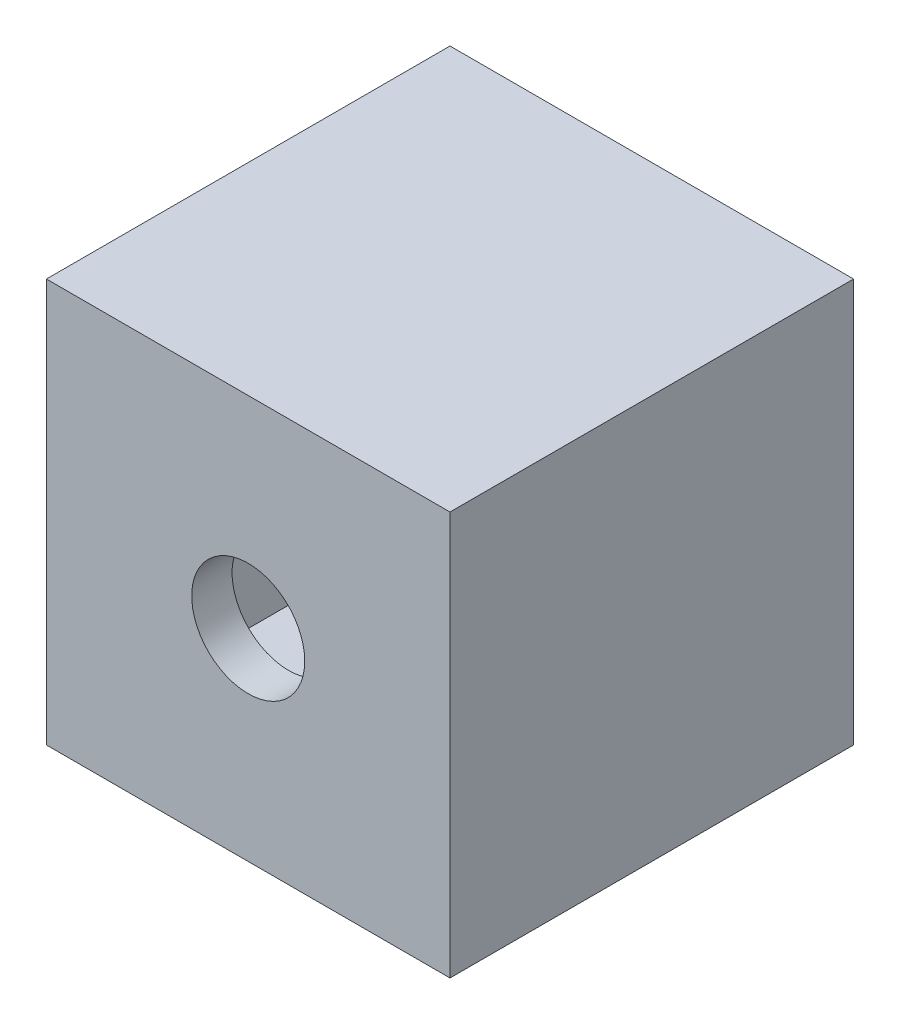
ISO-10303-21;
HEADER;
FILE_DESCRIPTION(('STEP AP214'),'2;1');
FILE_NAME('part.step','',(''),(''),'','','');
FILE_SCHEMA(('AUTOMOTIVE_DESIGN { 1 0 10303 214 1 1 1 1 }'));
ENDSEC;
DATA;
#1=APPLICATION_CONTEXT('core data for automotive mechanical design processes');
#2=APPLICATION_PROTOCOL_DEFINITION('international standard','automotive_design',2000,#1);
#3=PRODUCT_CONTEXT('',#1,'mechanical');
#4=PRODUCT('Part','Part','',(#3));
#5=PRODUCT_RELATED_PRODUCT_CATEGORY('part','',(#4));
#6=PRODUCT_DEFINITION_FORMATION('','',#4);
#7=PRODUCT_DEFINITION_CONTEXT('part definition',#1,'design');
#8=PRODUCT_DEFINITION('design','',#6,#7);
#9=PRODUCT_DEFINITION_SHAPE('','',#8);
#10=(LENGTH_UNIT() NAMED_UNIT(*) SI_UNIT(.MILLI.,.METRE.));
#11=(NAMED_UNIT(*) PLANE_ANGLE_UNIT() SI_UNIT($,.RADIAN.));
#12=(NAMED_UNIT(*) SI_UNIT($,.STERADIAN.) SOLID_ANGLE_UNIT());
#13=UNCERTAINTY_MEASURE_WITH_UNIT(LENGTH_MEASURE(1.E-05),#10,'distance_accuracy_value','');
#14=(GEOMETRIC_REPRESENTATION_CONTEXT(3) GLOBAL_UNCERTAINTY_ASSIGNED_CONTEXT((#13)) GLOBAL_UNIT_ASSIGNED_CONTEXT((#10,
#11,#12)) REPRESENTATION_CONTEXT('',''));
#15=CARTESIAN_POINT('',(0.,0.,0.));
#16=DIRECTION('',(0.,0.,1.));
#17=DIRECTION('',(1.,0.,0.));
#18=AXIS2_PLACEMENT_3D('',#15,#16,#17);
#19=CARTESIAN_POINT('',(0.,0.,0.));
#20=DIRECTION('',(0.,0.,-1.));
#21=DIRECTION('',(-1.,0.,0.));
#22=AXIS2_PLACEMENT_3D('',#19,#20,#21);
#23=PLANE('',#22);
#24=DIRECTION('',(0.,1.,0.));
#25=VECTOR('',#24,1.);
#26=CARTESIAN_POINT('',(100.,-100.,0.));
#27=LINE('',#26,#25);
#28=CARTESIAN_POINT('',(100.,-100.,0.));
#29=VERTEX_POINT('',#28);
#30=CARTESIAN_POINT('',(100.,100.,0.));
#31=VERTEX_POINT('',#30);
#32=EDGE_CURVE('E133',#29,#31,#27,.T.);
#33=ORIENTED_EDGE('',*,*,#32,.F.);
#34=DIRECTION('',(1.,0.,0.));
#35=VECTOR('',#34,1.);
#36=CARTESIAN_POINT('',(-100.,-100.,0.));
#37=LINE('',#36,#35);
#38=CARTESIAN_POINT('',(-100.,-100.,0.));
#39=VERTEX_POINT('',#38);
#40=EDGE_CURVE('E81',#39,#29,#37,.T.);
#41=ORIENTED_EDGE('',*,*,#40,.F.);
#42=DIRECTION('',(0.,-1.,0.));
#43=VECTOR('',#42,1.);
#44=CARTESIAN_POINT('',(-100.,-100.,0.));
#45=LINE('',#44,#43);
#46=CARTESIAN_POINT('',(-100.,100.,0.));
#47=VERTEX_POINT('',#46);
#48=EDGE_CURVE('E163',#47,#39,#45,.T.);
#49=ORIENTED_EDGE('',*,*,#48,.F.);
#50=DIRECTION('',(-1.,0.,0.));
#51=VECTOR('',#50,1.);
#52=CARTESIAN_POINT('',(-100.,100.,0.));
#53=LINE('',#52,#51);
#54=EDGE_CURVE('E137',#31,#47,#53,.T.);
#55=ORIENTED_EDGE('',*,*,#54,.F.);
#56=EDGE_LOOP('',(#33,#41,#49,#55));
#57=FACE_BOUND('',#56,.T.);
#58=DIRECTION('',(1.,0.,0.));
#59=VECTOR('',#58,1.);
#60=CARTESIAN_POINT('',(0.,-80.,0.));
#61=LINE('',#60,#59);
#62=CARTESIAN_POINT('',(-80.,-80.,0.));
#63=VERTEX_POINT('',#62);
#64=CARTESIAN_POINT('',(80.,-80.,0.));
#65=VERTEX_POINT('',#64);
#66=EDGE_CURVE('E128',#63,#65,#61,.T.);
#67=ORIENTED_EDGE('',*,*,#66,.T.);
#68=DIRECTION('',(0.,1.,0.));
#69=VECTOR('',#68,1.);
#70=CARTESIAN_POINT('',(80.,0.,0.));
#71=LINE('',#70,#69);
#72=CARTESIAN_POINT('',(80.,80.,0.));
#73=VERTEX_POINT('',#72);
#74=EDGE_CURVE('E149',#65,#73,#71,.T.);
#75=ORIENTED_EDGE('',*,*,#74,.T.);
#76=DIRECTION('',(-1.,0.,0.));
#77=VECTOR('',#76,1.);
#78=CARTESIAN_POINT('',(0.,80.,0.));
#79=LINE('',#78,#77);
#80=CARTESIAN_POINT('',(-80.,80.,0.));
#81=VERTEX_POINT('',#80);
#82=EDGE_CURVE('E132',#73,#81,#79,.T.);
#83=ORIENTED_EDGE('',*,*,#82,.T.);
#84=DIRECTION('',(0.,-1.,0.));
#85=VECTOR('',#84,1.);
#86=CARTESIAN_POINT('',(-80.,0.,0.));
#87=LINE('',#86,#85);
#88=EDGE_CURVE('E51',#81,#63,#87,.T.);
#89=ORIENTED_EDGE('',*,*,#88,.T.);
#90=EDGE_LOOP('',(#67,#75,#83,#89));
#91=FACE_BOUND('',#90,.T.);
#92=ADVANCED_FACE('F35',(#57,#91),#23,.T.);
#93=CARTESIAN_POINT('',(100.,-100.,200.));
#94=DIRECTION('',(-1.,0.,0.));
#95=DIRECTION('',(0.,0.,1.));
#96=AXIS2_PLACEMENT_3D('',#93,#94,#95);
#97=PLANE('',#96);
#98=ORIENTED_EDGE('',*,*,#32,.T.);
#99=DIRECTION('',(0.,0.,-1.));
#100=VECTOR('',#99,1.);
#101=CARTESIAN_POINT('',(100.,100.,200.));
#102=LINE('',#101,#100);
#103=CARTESIAN_POINT('',(100.,100.,200.));
#104=VERTEX_POINT('',#103);
#105=EDGE_CURVE('E11',#104,#31,#102,.T.);
#106=ORIENTED_EDGE('',*,*,#105,.F.);
#107=DIRECTION('',(0.,1.,0.));
#108=VECTOR('',#107,1.);
#109=CARTESIAN_POINT('',(100.,-100.,200.));
#110=LINE('',#109,#108);
#111=CARTESIAN_POINT('',(100.,-100.,200.));
#112=VERTEX_POINT('',#111);
#113=EDGE_CURVE('E155',#112,#104,#110,.T.);
#114=ORIENTED_EDGE('',*,*,#113,.F.);
#115=DIRECTION('',(0.,0.,-1.));
#116=VECTOR('',#115,1.);
#117=CARTESIAN_POINT('',(100.,-100.,200.));
#118=LINE('',#117,#116);
#119=EDGE_CURVE('E160',#112,#29,#118,.T.);
#120=ORIENTED_EDGE('',*,*,#119,.T.);
#121=EDGE_LOOP('',(#98,#106,#114,#120));
#122=FACE_BOUND('',#121,.T.);
#123=ADVANCED_FACE('F37',(#122),#97,.F.);
#124=CARTESIAN_POINT('',(-100.,100.,200.));
#125=DIRECTION('',(0.,-1.,0.));
#126=DIRECTION('',(0.,0.,-1.));
#127=AXIS2_PLACEMENT_3D('',#124,#125,#126);
#128=PLANE('',#127);
#129=ORIENTED_EDGE('',*,*,#54,.T.);
#130=DIRECTION('',(0.,0.,-1.));
#131=VECTOR('',#130,1.);
#132=CARTESIAN_POINT('',(-100.,100.,200.));
#133=LINE('',#132,#131);
#134=CARTESIAN_POINT('',(-100.,100.,200.));
#135=VERTEX_POINT('',#134);
#136=EDGE_CURVE('E44',#135,#47,#133,.T.);
#137=ORIENTED_EDGE('',*,*,#136,.F.);
#138=DIRECTION('',(-1.,0.,0.));
#139=VECTOR('',#138,1.);
#140=CARTESIAN_POINT('',(-100.,100.,200.));
#141=LINE('',#140,#139);
#142=EDGE_CURVE('E88',#104,#135,#141,.T.);
#143=ORIENTED_EDGE('',*,*,#142,.F.);
#144=ORIENTED_EDGE('',*,*,#105,.T.);
#145=EDGE_LOOP('',(#129,#137,#143,#144));
#146=FACE_BOUND('',#145,.T.);
#147=ADVANCED_FACE('F191',(#146),#128,.F.);
#148=CARTESIAN_POINT('',(-100.,-100.,200.));
#149=DIRECTION('',(1.,0.,0.));
#150=DIRECTION('',(0.,0.,-1.));
#151=AXIS2_PLACEMENT_3D('',#148,#149,#150);
#152=PLANE('',#151);
#153=ORIENTED_EDGE('',*,*,#48,.T.);
#154=DIRECTION('',(0.,0.,-1.));
#155=VECTOR('',#154,1.);
#156=CARTESIAN_POINT('',(-100.,-100.,200.));
#157=LINE('',#156,#155);
#158=CARTESIAN_POINT('',(-100.,-100.,200.));
#159=VERTEX_POINT('',#158);
#160=EDGE_CURVE('E167',#159,#39,#157,.T.);
#161=ORIENTED_EDGE('',*,*,#160,.F.);
#162=DIRECTION('',(0.,-1.,0.));
#163=VECTOR('',#162,1.);
#164=CARTESIAN_POINT('',(-100.,-100.,200.));
#165=LINE('',#164,#163);
#166=EDGE_CURVE('E158',#135,#159,#165,.T.);
#167=ORIENTED_EDGE('',*,*,#166,.F.);
#168=ORIENTED_EDGE('',*,*,#136,.T.);
#169=EDGE_LOOP('',(#153,#161,#167,#168));
#170=FACE_BOUND('',#169,.T.);
#171=ADVANCED_FACE('F173',(#170),#152,.F.);
#172=CARTESIAN_POINT('',(-100.,-100.,200.));
#173=DIRECTION('',(0.,1.,0.));
#174=DIRECTION('',(0.,0.,1.));
#175=AXIS2_PLACEMENT_3D('',#172,#173,#174);
#176=PLANE('',#175);
#177=ORIENTED_EDGE('',*,*,#40,.T.);
#178=ORIENTED_EDGE('',*,*,#119,.F.);
#179=DIRECTION('',(1.,0.,0.));
#180=VECTOR('',#179,1.);
#181=CARTESIAN_POINT('',(-100.,-100.,200.));
#182=LINE('',#181,#180);
#183=EDGE_CURVE('E60',#159,#112,#182,.T.);
#184=ORIENTED_EDGE('',*,*,#183,.F.);
#185=ORIENTED_EDGE('',*,*,#160,.T.);
#186=EDGE_LOOP('',(#177,#178,#184,#185));
#187=FACE_BOUND('',#186,.T.);
#188=ADVANCED_FACE('F181',(#187),#176,.F.);
#189=CARTESIAN_POINT('',(0.,0.,200.));
#190=DIRECTION('',(0.,0.,-1.));
#191=DIRECTION('',(-1.,0.,0.));
#192=AXIS2_PLACEMENT_3D('',#189,#190,#191);
#193=PLANE('',#192);
#194=CARTESIAN_POINT('',(0.,0.,200.));
#195=DIRECTION('',(0.,0.,1.));
#196=DIRECTION('',(1.,0.,0.));
#197=AXIS2_PLACEMENT_3D('',#194,#195,#196);
#198=CIRCLE('',#197,28.);
#199=CARTESIAN_POINT('',(28.,0.,200.));
#200=VERTEX_POINT('',#199);
#201=EDGE_CURVE('E142',#200,#200,#198,.T.);
#202=ORIENTED_EDGE('',*,*,#201,.F.);
#203=EDGE_LOOP('',(#202));
#204=FACE_BOUND('',#203,.T.);
#205=ORIENTED_EDGE('',*,*,#113,.T.);
#206=ORIENTED_EDGE('',*,*,#142,.T.);
#207=ORIENTED_EDGE('',*,*,#166,.T.);
#208=ORIENTED_EDGE('',*,*,#183,.T.);
#209=EDGE_LOOP('',(#205,#206,#207,#208));
#210=FACE_BOUND('',#209,.T.);
#211=ADVANCED_FACE('F183',(#204,#210),#193,.F.);
#212=CARTESIAN_POINT('',(80.,-100.,200.));
#213=DIRECTION('',(-1.,0.,0.));
#214=DIRECTION('',(0.,0.,1.));
#215=AXIS2_PLACEMENT_3D('',#212,#213,#214);
#216=PLANE('',#215);
#217=ORIENTED_EDGE('',*,*,#74,.F.);
#218=DIRECTION('',(0.,0.,-1.));
#219=VECTOR('',#218,1.);
#220=CARTESIAN_POINT('',(80.,-80.,200.));
#221=LINE('',#220,#219);
#222=CARTESIAN_POINT('',(80.,-80.,180.));
#223=VERTEX_POINT('',#222);
#224=EDGE_CURVE('E127',#223,#65,#221,.T.);
#225=ORIENTED_EDGE('',*,*,#224,.F.);
#226=DIRECTION('',(0.,1.,0.));
#227=VECTOR('',#226,1.);
#228=CARTESIAN_POINT('',(80.,0.,180.));
#229=LINE('',#228,#227);
#230=CARTESIAN_POINT('',(80.,80.,180.));
#231=VERTEX_POINT('',#230);
#232=EDGE_CURVE('E115',#223,#231,#229,.T.);
#233=ORIENTED_EDGE('',*,*,#232,.T.);
#234=DIRECTION('',(0.,0.,-1.));
#235=VECTOR('',#234,1.);
#236=CARTESIAN_POINT('',(80.,80.,200.));
#237=LINE('',#236,#235);
#238=EDGE_CURVE('E125',#231,#73,#237,.T.);
#239=ORIENTED_EDGE('',*,*,#238,.T.);
#240=EDGE_LOOP('',(#217,#225,#233,#239));
#241=FACE_BOUND('',#240,.T.);
#242=ADVANCED_FACE('F124',(#241),#216,.T.);
#243=CARTESIAN_POINT('',(-100.,80.,200.));
#244=DIRECTION('',(0.,-1.,0.));
#245=DIRECTION('',(0.,0.,-1.));
#246=AXIS2_PLACEMENT_3D('',#243,#244,#245);
#247=PLANE('',#246);
#248=ORIENTED_EDGE('',*,*,#82,.F.);
#249=ORIENTED_EDGE('',*,*,#238,.F.);
#250=DIRECTION('',(-1.,0.,0.));
#251=VECTOR('',#250,1.);
#252=CARTESIAN_POINT('',(0.,80.,180.));
#253=LINE('',#252,#251);
#254=CARTESIAN_POINT('',(-80.,80.,180.));
#255=VERTEX_POINT('',#254);
#256=EDGE_CURVE('E111',#231,#255,#253,.T.);
#257=ORIENTED_EDGE('',*,*,#256,.T.);
#258=DIRECTION('',(0.,0.,-1.));
#259=VECTOR('',#258,1.);
#260=CARTESIAN_POINT('',(-80.,80.,200.));
#261=LINE('',#260,#259);
#262=EDGE_CURVE('E134',#255,#81,#261,.T.);
#263=ORIENTED_EDGE('',*,*,#262,.T.);
#264=EDGE_LOOP('',(#248,#249,#257,#263));
#265=FACE_BOUND('',#264,.T.);
#266=ADVANCED_FACE('F130',(#265),#247,.T.);
#267=CARTESIAN_POINT('',(-80.,-100.,200.));
#268=DIRECTION('',(1.,0.,0.));
#269=DIRECTION('',(0.,0.,-1.));
#270=AXIS2_PLACEMENT_3D('',#267,#268,#269);
#271=PLANE('',#270);
#272=ORIENTED_EDGE('',*,*,#88,.F.);
#273=ORIENTED_EDGE('',*,*,#262,.F.);
#274=DIRECTION('',(0.,-1.,0.));
#275=VECTOR('',#274,1.);
#276=CARTESIAN_POINT('',(-80.,0.,180.));
#277=LINE('',#276,#275);
#278=CARTESIAN_POINT('',(-80.,-80.,180.));
#279=VERTEX_POINT('',#278);
#280=EDGE_CURVE('E116',#255,#279,#277,.T.);
#281=ORIENTED_EDGE('',*,*,#280,.T.);
#282=DIRECTION('',(0.,0.,-1.));
#283=VECTOR('',#282,1.);
#284=CARTESIAN_POINT('',(-80.,-80.,200.));
#285=LINE('',#284,#283);
#286=EDGE_CURVE('E139',#279,#63,#285,.T.);
#287=ORIENTED_EDGE('',*,*,#286,.T.);
#288=EDGE_LOOP('',(#272,#273,#281,#287));
#289=FACE_BOUND('',#288,.T.);
#290=ADVANCED_FACE('F206',(#289),#271,.T.);
#291=CARTESIAN_POINT('',(-100.,-80.,200.));
#292=DIRECTION('',(0.,1.,0.));
#293=DIRECTION('',(0.,0.,1.));
#294=AXIS2_PLACEMENT_3D('',#291,#292,#293);
#295=PLANE('',#294);
#296=ORIENTED_EDGE('',*,*,#66,.F.);
#297=ORIENTED_EDGE('',*,*,#286,.F.);
#298=DIRECTION('',(1.,0.,0.));
#299=VECTOR('',#298,1.);
#300=CARTESIAN_POINT('',(0.,-80.,180.));
#301=LINE('',#300,#299);
#302=EDGE_CURVE('E144',#279,#223,#301,.T.);
#303=ORIENTED_EDGE('',*,*,#302,.T.);
#304=ORIENTED_EDGE('',*,*,#224,.T.);
#305=EDGE_LOOP('',(#296,#297,#303,#304));
#306=FACE_BOUND('',#305,.T.);
#307=ADVANCED_FACE('F202',(#306),#295,.T.);
#308=CARTESIAN_POINT('',(0.,0.,180.));
#309=DIRECTION('',(0.,0.,-1.));
#310=DIRECTION('',(-1.,0.,0.));
#311=AXIS2_PLACEMENT_3D('',#308,#309,#310);
#312=PLANE('',#311);
#313=CARTESIAN_POINT('',(0.,0.,180.));
#314=DIRECTION('',(0.,0.,-1.));
#315=DIRECTION('',(-1.,0.,0.));
#316=AXIS2_PLACEMENT_3D('',#313,#314,#315);
#317=CIRCLE('',#316,28.);
#318=CARTESIAN_POINT('',(28.,0.,180.));
#319=VERTEX_POINT('',#318);
#320=EDGE_CURVE('E39',#319,#319,#317,.T.);
#321=ORIENTED_EDGE('',*,*,#320,.F.);
#322=EDGE_LOOP('',(#321));
#323=FACE_BOUND('',#322,.T.);
#324=ORIENTED_EDGE('',*,*,#232,.F.);
#325=ORIENTED_EDGE('',*,*,#302,.F.);
#326=ORIENTED_EDGE('',*,*,#280,.F.);
#327=ORIENTED_EDGE('',*,*,#256,.F.);
#328=EDGE_LOOP('',(#324,#325,#326,#327));
#329=FACE_BOUND('',#328,.T.);
#330=ADVANCED_FACE('F113',(#323,#329),#312,.T.);
#331=CARTESIAN_POINT('',(0.,0.,148.4));
#332=DIRECTION('',(0.,0.,1.));
#333=DIRECTION('',(1.,0.,0.));
#334=AXIS2_PLACEMENT_3D('',#331,#332,#333);
#335=CYLINDRICAL_SURFACE('',#334,28.);
#336=CARTESIAN_POINT('',(28.,0.,180.));
#337=CARTESIAN_POINT('',(28.,0.,180.208333333333));
#338=CARTESIAN_POINT('',(28.,0.,180.416666666667));
#339=CARTESIAN_POINT('',(28.,0.,180.833333333333));
#340=CARTESIAN_POINT('',(28.,0.,181.041666666667));
#341=CARTESIAN_POINT('',(28.,0.,181.458333333333));
#342=CARTESIAN_POINT('',(28.,0.,181.666666666667));
#343=CARTESIAN_POINT('',(28.,0.,182.083333333333));
#344=CARTESIAN_POINT('',(28.,0.,182.291666666667));
#345=CARTESIAN_POINT('',(28.,0.,182.708333333333));
#346=CARTESIAN_POINT('',(28.,0.,182.916666666667));
#347=CARTESIAN_POINT('',(28.,0.,183.333333333333));
#348=CARTESIAN_POINT('',(28.,0.,183.541666666667));
#349=CARTESIAN_POINT('',(28.,0.,183.958333333333));
#350=CARTESIAN_POINT('',(28.,0.,184.166666666667));
#351=CARTESIAN_POINT('',(28.,0.,184.583333333333));
#352=CARTESIAN_POINT('',(28.,0.,184.791666666667));
#353=CARTESIAN_POINT('',(28.,0.,185.208333333333));
#354=CARTESIAN_POINT('',(28.,0.,185.416666666667));
#355=CARTESIAN_POINT('',(28.,0.,185.833333333333));
#356=CARTESIAN_POINT('',(28.,0.,186.041666666667));
#357=CARTESIAN_POINT('',(28.,0.,186.458333333333));
#358=CARTESIAN_POINT('',(28.,0.,186.666666666667));
#359=CARTESIAN_POINT('',(28.,0.,187.083333333333));
#360=CARTESIAN_POINT('',(28.,0.,187.291666666667));
#361=CARTESIAN_POINT('',(28.,0.,187.708333333333));
#362=CARTESIAN_POINT('',(28.,0.,187.916666666667));
#363=CARTESIAN_POINT('',(28.,0.,188.333333333333));
#364=CARTESIAN_POINT('',(28.,0.,188.541666666667));
#365=CARTESIAN_POINT('',(28.,0.,188.958333333333));
#366=CARTESIAN_POINT('',(28.,0.,189.166666666667));
#367=CARTESIAN_POINT('',(28.,0.,189.583333333333));
#368=CARTESIAN_POINT('',(28.,0.,189.791666666667));
#369=CARTESIAN_POINT('',(28.,0.,190.208333333333));
#370=CARTESIAN_POINT('',(28.,0.,190.416666666667));
#371=CARTESIAN_POINT('',(28.,0.,190.833333333333));
#372=CARTESIAN_POINT('',(28.,0.,191.041666666667));
#373=CARTESIAN_POINT('',(28.,0.,191.458333333333));
#374=CARTESIAN_POINT('',(28.,0.,191.666666666667));
#375=CARTESIAN_POINT('',(28.,0.,192.083333333333));
#376=CARTESIAN_POINT('',(28.,0.,192.291666666667));
#377=CARTESIAN_POINT('',(28.,0.,192.708333333333));
#378=CARTESIAN_POINT('',(28.,0.,192.916666666667));
#379=CARTESIAN_POINT('',(28.,0.,193.333333333333));
#380=CARTESIAN_POINT('',(28.,0.,193.541666666667));
#381=CARTESIAN_POINT('',(28.,0.,193.958333333333));
#382=CARTESIAN_POINT('',(28.,0.,194.166666666667));
#383=CARTESIAN_POINT('',(28.,0.,194.583333333333));
#384=CARTESIAN_POINT('',(28.,0.,194.791666666667));
#385=CARTESIAN_POINT('',(28.,0.,195.208333333333));
#386=CARTESIAN_POINT('',(28.,0.,195.416666666667));
#387=CARTESIAN_POINT('',(28.,0.,195.833333333333));
#388=CARTESIAN_POINT('',(28.,0.,196.041666666667));
#389=CARTESIAN_POINT('',(28.,0.,196.458333333333));
#390=CARTESIAN_POINT('',(28.,0.,196.666666666667));
#391=CARTESIAN_POINT('',(28.,0.,197.083333333333));
#392=CARTESIAN_POINT('',(28.,0.,197.291666666667));
#393=CARTESIAN_POINT('',(28.,0.,197.708333333333));
#394=CARTESIAN_POINT('',(28.,0.,197.916666666667));
#395=CARTESIAN_POINT('',(28.,0.,198.333333333333));
#396=CARTESIAN_POINT('',(28.,0.,198.541666666667));
#397=CARTESIAN_POINT('',(28.,0.,198.958333333333));
#398=CARTESIAN_POINT('',(28.,0.,199.166666666667));
#399=CARTESIAN_POINT('',(28.,0.,199.583333333333));
#400=CARTESIAN_POINT('',(28.,0.,199.791666666667));
#401=CARTESIAN_POINT('',(28.,0.,200.));
#402=B_SPLINE_CURVE_WITH_KNOTS('',3,(#336,#337,#338,#339,#340,#341,#342,#343,#344,#345,#346,
#347,#348,#349,#350,#351,#352,#353,#354,#355,#356,#357,#358,#359,#360,#361,#362,#363,#364,#365,
#366,#367,#368,#369,#370,#371,#372,#373,#374,#375,#376,#377,#378,#379,#380,#381,#382,#383,#384,
#385,#386,#387,#388,#389,#390,#391,#392,#393,#394,#395,#396,#397,#398,#399,#400,#401),
.UNSPECIFIED.,.F.,.F.,(4,2,2,2,2,2,2,2,2,2,2,2,2,2,2,2,2,2,2,2,2,2,2,2,2,2,2,2,2,2,2,2,4),(0.,
0.625000000000014,1.25,1.87499999999999,2.5,3.12500000000002,3.75,4.37499999999999,5.,
5.62499999999999,6.25000000000001,6.87499999999999,7.49999999999998,8.12499999999999,
8.74999999999998,9.37499999999999,9.99999999999998,10.625,11.25,11.875,12.5,13.125,13.75,14.375,
15.,15.625,16.25,16.875,17.5,18.125,18.75,19.375,20.),.UNSPECIFIED.);
#403=EDGE_CURVE('BSEAM201',#319,#200,#402,.T.);
#404=ORIENTED_EDGE('',*,*,#320,.T.);
#405=ORIENTED_EDGE('',*,*,#201,.T.);
#406=ORIENTED_EDGE('',*,*,#403,.T.);
#407=ORIENTED_EDGE('',*,*,#403,.F.);
#408=EDGE_LOOP('',(#404,#406,#405,#407));
#409=FACE_BOUND('',#408,.T.);
#410=ADVANCED_FACE('F201',(#409),#335,.F.);
#411=CLOSED_SHELL('',(#92,#123,#147,#171,#188,#211,#242,#266,#290,#307,#330,#410));
#412=MANIFOLD_SOLID_BREP('B2',#411);
#413=ADVANCED_BREP_SHAPE_REPRESENTATION('',(#18,#412),#14);
#414=SHAPE_DEFINITION_REPRESENTATION(#9,#413);
ENDSEC;
END-ISO-10303-21;
